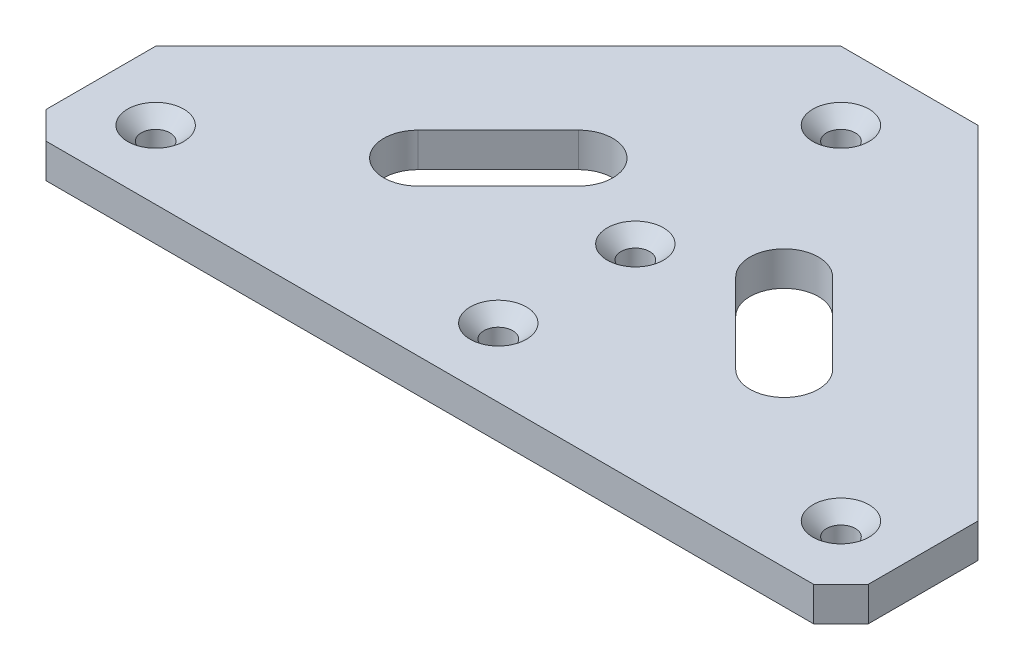
ISO-10303-21;
HEADER;
FILE_DESCRIPTION(('STEP AP214'),'2;1');
FILE_NAME('part.step','',(''),(''),'','','');
FILE_SCHEMA(('AUTOMOTIVE_DESIGN { 1 0 10303 214 1 1 1 1 }'));
ENDSEC;
DATA;
#1=APPLICATION_CONTEXT('core data for automotive mechanical design processes');
#2=APPLICATION_PROTOCOL_DEFINITION('international standard','automotive_design',2000,#1);
#3=PRODUCT_CONTEXT('',#1,'mechanical');
#4=PRODUCT('Part','Part','',(#3));
#5=PRODUCT_RELATED_PRODUCT_CATEGORY('part','',(#4));
#6=PRODUCT_DEFINITION_FORMATION('','',#4);
#7=PRODUCT_DEFINITION_CONTEXT('part definition',#1,'design');
#8=PRODUCT_DEFINITION('design','',#6,#7);
#9=PRODUCT_DEFINITION_SHAPE('','',#8);
#10=(LENGTH_UNIT() NAMED_UNIT(*) SI_UNIT(.MILLI.,.METRE.));
#11=(NAMED_UNIT(*) PLANE_ANGLE_UNIT() SI_UNIT($,.RADIAN.));
#12=(NAMED_UNIT(*) SI_UNIT($,.STERADIAN.) SOLID_ANGLE_UNIT());
#13=UNCERTAINTY_MEASURE_WITH_UNIT(LENGTH_MEASURE(1.E-05),#10,'distance_accuracy_value','');
#14=(GEOMETRIC_REPRESENTATION_CONTEXT(3) GLOBAL_UNCERTAINTY_ASSIGNED_CONTEXT((#13)) GLOBAL_UNIT_ASSIGNED_CONTEXT((#10,
#11,#12)) REPRESENTATION_CONTEXT('',''));
#15=CARTESIAN_POINT('',(0.,0.,0.));
#16=DIRECTION('',(0.,0.,1.));
#17=DIRECTION('',(1.,0.,0.));
#18=AXIS2_PLACEMENT_3D('',#15,#16,#17);
#19=CARTESIAN_POINT('',(0.,2.5,0.));
#20=DIRECTION('',(0.,-1.,0.));
#21=DIRECTION('',(0.,0.,-1.));
#22=AXIS2_PLACEMENT_3D('',#19,#20,#21);
#23=PLANE('',#22);
#24=DIRECTION('',(0.707106781186548,0.,-0.707106781186547));
#25=VECTOR('',#24,1.);
#26=CARTESIAN_POINT('',(-23.1801948466054,2.5,13.5355339059327));
#27=LINE('',#26,#25);
#28=CARTESIAN_POINT('',(-23.1801948466054,2.5,13.5355339059327));
#29=VERTEX_POINT('',#28);
#30=CARTESIAN_POINT('',(-11.4644660940673,2.5,1.81980515339463));
#31=VERTEX_POINT('',#30);
#32=EDGE_CURVE('E180',#29,#31,#27,.T.);
#33=ORIENTED_EDGE('',*,*,#32,.F.);
#34=CARTESIAN_POINT('',(-26.7157287525381,2.5,10.));
#35=DIRECTION('',(0.,1.,0.));
#36=DIRECTION('',(0.,0.,1.));
#37=AXIS2_PLACEMENT_3D('',#34,#35,#36);
#38=CIRCLE('',#37,4.99999999999999);
#39=CARTESIAN_POINT('',(-30.2512626584709,2.5,6.46446609406727));
#40=VERTEX_POINT('',#39);
#41=EDGE_CURVE('E53',#40,#29,#38,.T.);
#42=ORIENTED_EDGE('',*,*,#41,.F.);
#43=DIRECTION('',(-0.707106781186547,0.,0.707106781186548));
#44=VECTOR('',#43,1.);
#45=CARTESIAN_POINT('',(-30.2512626584709,2.5,6.46446609406727));
#46=LINE('',#45,#44);
#47=CARTESIAN_POINT('',(-18.5355339059327,2.5,-5.25126265847085));
#48=VERTEX_POINT('',#47);
#49=EDGE_CURVE('E171',#48,#40,#46,.T.);
#50=ORIENTED_EDGE('',*,*,#49,.F.);
#51=CARTESIAN_POINT('',(-15.,2.5,-1.71572875253811));
#52=DIRECTION('',(0.,1.,0.));
#53=DIRECTION('',(0.,0.,1.));
#54=AXIS2_PLACEMENT_3D('',#51,#52,#53);
#55=CIRCLE('',#54,5.);
#56=EDGE_CURVE('E174',#31,#48,#55,.T.);
#57=ORIENTED_EDGE('',*,*,#56,.F.);
#58=EDGE_LOOP('',(#33,#42,#50,#57));
#59=FACE_BOUND('',#58,.T.);
#60=DIRECTION('',(-0.707106781186548,0.,-0.707106781186548));
#61=VECTOR('',#60,1.);
#62=CARTESIAN_POINT('',(30.2512626584709,2.5,6.46446609406727));
#63=LINE('',#62,#61);
#64=CARTESIAN_POINT('',(30.2512626584708,2.5,6.46446609406727));
#65=VERTEX_POINT('',#64);
#66=CARTESIAN_POINT('',(18.5355339059327,2.5,-5.25126265847085));
#67=VERTEX_POINT('',#66);
#68=EDGE_CURVE('E206',#65,#67,#63,.T.);
#69=ORIENTED_EDGE('',*,*,#68,.F.);
#70=CARTESIAN_POINT('',(26.7157287525381,2.5,10.));
#71=DIRECTION('',(0.,1.,0.));
#72=DIRECTION('',(0.,0.,-1.));
#73=AXIS2_PLACEMENT_3D('',#70,#71,#72);
#74=CIRCLE('',#73,4.99999999999999);
#75=CARTESIAN_POINT('',(23.1801948466054,2.5,13.5355339059327));
#76=VERTEX_POINT('',#75);
#77=EDGE_CURVE('E61',#76,#65,#74,.T.);
#78=ORIENTED_EDGE('',*,*,#77,.F.);
#79=DIRECTION('',(0.707106781186548,0.,0.707106781186547));
#80=VECTOR('',#79,1.);
#81=CARTESIAN_POINT('',(23.1801948466054,2.5,13.5355339059327));
#82=LINE('',#81,#80);
#83=CARTESIAN_POINT('',(11.4644660940673,2.5,1.81980515339463));
#84=VERTEX_POINT('',#83);
#85=EDGE_CURVE('E195',#84,#76,#82,.T.);
#86=ORIENTED_EDGE('',*,*,#85,.F.);
#87=CARTESIAN_POINT('',(15.,2.5,-1.71572875253811));
#88=DIRECTION('',(0.,1.,0.));
#89=DIRECTION('',(0.,0.,-1.));
#90=AXIS2_PLACEMENT_3D('',#87,#88,#89);
#91=CIRCLE('',#90,5.);
#92=EDGE_CURVE('E209',#67,#84,#91,.T.);
#93=ORIENTED_EDGE('',*,*,#92,.F.);
#94=EDGE_LOOP('',(#69,#78,#86,#93));
#95=FACE_BOUND('',#94,.T.);
#96=CARTESIAN_POINT('',(-50.,2.5,25.));
#97=DIRECTION('',(0.,-1.,0.));
#98=DIRECTION('',(0.,0.,-1.));
#99=AXIS2_PLACEMENT_3D('',#96,#97,#98);
#100=CIRCLE('',#99,4.10000000000001);
#101=CARTESIAN_POINT('',(-50.,2.5,20.9));
#102=VERTEX_POINT('',#101);
#103=EDGE_CURVE('E290',#102,#102,#100,.T.);
#104=ORIENTED_EDGE('',*,*,#103,.T.);
#105=EDGE_LOOP('',(#104));
#106=FACE_BOUND('',#105,.T.);
#107=CARTESIAN_POINT('',(50.,2.5,25.));
#108=DIRECTION('',(0.,-1.,0.));
#109=DIRECTION('',(0.,0.,-1.));
#110=AXIS2_PLACEMENT_3D('',#107,#108,#109);
#111=CIRCLE('',#110,4.10000000000001);
#112=CARTESIAN_POINT('',(50.,2.5,20.9));
#113=VERTEX_POINT('',#112);
#114=EDGE_CURVE('E287',#113,#113,#111,.T.);
#115=ORIENTED_EDGE('',*,*,#114,.T.);
#116=EDGE_LOOP('',(#115));
#117=FACE_BOUND('',#116,.T.);
#118=CARTESIAN_POINT('',(0.,2.5,25.));
#119=DIRECTION('',(0.,-1.,0.));
#120=DIRECTION('',(0.,0.,-1.));
#121=AXIS2_PLACEMENT_3D('',#118,#119,#120);
#122=CIRCLE('',#121,4.10000000000001);
#123=CARTESIAN_POINT('',(0.,2.5,20.9));
#124=VERTEX_POINT('',#123);
#125=EDGE_CURVE('E284',#124,#124,#122,.T.);
#126=ORIENTED_EDGE('',*,*,#125,.T.);
#127=EDGE_LOOP('',(#126));
#128=FACE_BOUND('',#127,.T.);
#129=CARTESIAN_POINT('',(0.,2.5,5.));
#130=DIRECTION('',(0.,-1.,0.));
#131=DIRECTION('',(0.,0.,-1.));
#132=AXIS2_PLACEMENT_3D('',#129,#130,#131);
#133=CIRCLE('',#132,4.10000000000001);
#134=CARTESIAN_POINT('',(0.,2.5,0.899999999999995));
#135=VERTEX_POINT('',#134);
#136=EDGE_CURVE('E281',#135,#135,#133,.T.);
#137=ORIENTED_EDGE('',*,*,#136,.T.);
#138=EDGE_LOOP('',(#137));
#139=FACE_BOUND('',#138,.T.);
#140=CARTESIAN_POINT('',(0.,2.5,-25.));
#141=DIRECTION('',(0.,-1.,0.));
#142=DIRECTION('',(0.,0.,-1.));
#143=AXIS2_PLACEMENT_3D('',#140,#141,#142);
#144=CIRCLE('',#143,4.10000000000001);
#145=CARTESIAN_POINT('',(0.,2.5,-29.1));
#146=VERTEX_POINT('',#145);
#147=EDGE_CURVE('E278',#146,#146,#144,.T.);
#148=ORIENTED_EDGE('',*,*,#147,.T.);
#149=EDGE_LOOP('',(#148));
#150=FACE_BOUND('',#149,.T.);
#151=DIRECTION('',(1.,0.,0.));
#152=VECTOR('',#151,1.);
#153=CARTESIAN_POINT('',(-60.,2.5,35.));
#154=LINE('',#153,#152);
#155=CARTESIAN_POINT('',(-56.,2.5,35.));
#156=VERTEX_POINT('',#155);
#157=CARTESIAN_POINT('',(56.,2.5,35.));
#158=VERTEX_POINT('',#157);
#159=EDGE_CURVE('E243',#156,#158,#154,.T.);
#160=ORIENTED_EDGE('',*,*,#159,.T.);
#161=DIRECTION('',(-0.707106781186549,0.,0.707106781186546));
#162=VECTOR('',#161,1.);
#163=CARTESIAN_POINT('',(60.,2.5,31.));
#164=LINE('',#163,#162);
#165=CARTESIAN_POINT('',(60.,2.5,31.));
#166=VERTEX_POINT('',#165);
#167=EDGE_CURVE('E46',#158,#166,#164,.F.);
#168=ORIENTED_EDGE('',*,*,#167,.T.);
#169=DIRECTION('',(0.,0.,-1.));
#170=VECTOR('',#169,1.);
#171=CARTESIAN_POINT('',(60.,2.5,15.));
#172=LINE('',#171,#170);
#173=CARTESIAN_POINT('',(60.,2.5,15.));
#174=VERTEX_POINT('',#173);
#175=EDGE_CURVE('E246',#166,#174,#172,.T.);
#176=ORIENTED_EDGE('',*,*,#175,.T.);
#177=DIRECTION('',(-0.707106781186547,0.,-0.707106781186548));
#178=VECTOR('',#177,1.);
#179=CARTESIAN_POINT('',(10.,2.5,-35.));
#180=LINE('',#179,#178);
#181=CARTESIAN_POINT('',(10.,2.5,-35.));
#182=VERTEX_POINT('',#181);
#183=EDGE_CURVE('E248',#174,#182,#180,.T.);
#184=ORIENTED_EDGE('',*,*,#183,.T.);
#185=DIRECTION('',(-1.,0.,0.));
#186=VECTOR('',#185,1.);
#187=CARTESIAN_POINT('',(0.,2.5,-35.));
#188=LINE('',#187,#186);
#189=CARTESIAN_POINT('',(-10.,2.5,-35.));
#190=VERTEX_POINT('',#189);
#191=EDGE_CURVE('E235',#182,#190,#188,.T.);
#192=ORIENTED_EDGE('',*,*,#191,.T.);
#193=DIRECTION('',(-0.707106781186547,0.,0.707106781186548));
#194=VECTOR('',#193,1.);
#195=CARTESIAN_POINT('',(-10.,2.5,-35.));
#196=LINE('',#195,#194);
#197=CARTESIAN_POINT('',(-60.,2.5,15.));
#198=VERTEX_POINT('',#197);
#199=EDGE_CURVE('E237',#190,#198,#196,.T.);
#200=ORIENTED_EDGE('',*,*,#199,.T.);
#201=DIRECTION('',(0.,0.,1.));
#202=VECTOR('',#201,1.);
#203=CARTESIAN_POINT('',(-60.,2.5,15.));
#204=LINE('',#203,#202);
#205=CARTESIAN_POINT('',(-60.,2.5,31.));
#206=VERTEX_POINT('',#205);
#207=EDGE_CURVE('E240',#198,#206,#204,.T.);
#208=ORIENTED_EDGE('',*,*,#207,.T.);
#209=DIRECTION('',(-0.707106781186545,0.,-0.70710678118655));
#210=VECTOR('',#209,1.);
#211=CARTESIAN_POINT('',(-56.,2.5,35.));
#212=LINE('',#211,#210);
#213=EDGE_CURVE('E317',#206,#156,#212,.F.);
#214=ORIENTED_EDGE('',*,*,#213,.T.);
#215=EDGE_LOOP('',(#160,#168,#176,#184,#192,#200,#208,#214));
#216=FACE_BOUND('',#215,.T.);
#217=ADVANCED_FACE('F37',(#59,#95,#106,#117,#128,#139,#150,#216),#23,.F.);
#218=CARTESIAN_POINT('',(0.,-2.5,0.));
#219=DIRECTION('',(0.,-1.,0.));
#220=DIRECTION('',(0.,0.,-1.));
#221=AXIS2_PLACEMENT_3D('',#218,#219,#220);
#222=PLANE('',#221);
#223=CARTESIAN_POINT('',(-26.7157287525381,-2.5,10.));
#224=DIRECTION('',(0.,1.,0.));
#225=DIRECTION('',(0.,0.,1.));
#226=AXIS2_PLACEMENT_3D('',#223,#224,#225);
#227=CIRCLE('',#226,4.99999999999999);
#228=CARTESIAN_POINT('',(-30.2512626584709,-2.5,6.46446609406727));
#229=VERTEX_POINT('',#228);
#230=CARTESIAN_POINT('',(-23.1801948466054,-2.5,13.5355339059327));
#231=VERTEX_POINT('',#230);
#232=EDGE_CURVE('E152',#229,#231,#227,.T.);
#233=ORIENTED_EDGE('',*,*,#232,.T.);
#234=DIRECTION('',(0.707106781186548,0.,-0.707106781186547));
#235=VECTOR('',#234,1.);
#236=CARTESIAN_POINT('',(-23.1801948466054,-2.5,13.5355339059327));
#237=LINE('',#236,#235);
#238=CARTESIAN_POINT('',(-11.4644660940673,-2.5,1.81980515339463));
#239=VERTEX_POINT('',#238);
#240=EDGE_CURVE('E162',#231,#239,#237,.T.);
#241=ORIENTED_EDGE('',*,*,#240,.T.);
#242=CARTESIAN_POINT('',(-15.,-2.5,-1.71572875253811));
#243=DIRECTION('',(0.,1.,0.));
#244=DIRECTION('',(0.,0.,1.));
#245=AXIS2_PLACEMENT_3D('',#242,#243,#244);
#246=CIRCLE('',#245,5.);
#247=CARTESIAN_POINT('',(-18.5355339059327,-2.5,-5.25126265847085));
#248=VERTEX_POINT('',#247);
#249=EDGE_CURVE('E166',#239,#248,#246,.T.);
#250=ORIENTED_EDGE('',*,*,#249,.T.);
#251=DIRECTION('',(-0.707106781186547,0.,0.707106781186548));
#252=VECTOR('',#251,1.);
#253=CARTESIAN_POINT('',(-30.2512626584709,-2.5,6.46446609406727));
#254=LINE('',#253,#252);
#255=EDGE_CURVE('E158',#248,#229,#254,.T.);
#256=ORIENTED_EDGE('',*,*,#255,.T.);
#257=EDGE_LOOP('',(#233,#241,#250,#256));
#258=FACE_BOUND('',#257,.T.);
#259=CARTESIAN_POINT('',(26.7157287525381,-2.5,10.));
#260=DIRECTION('',(0.,1.,0.));
#261=DIRECTION('',(0.,0.,-1.));
#262=AXIS2_PLACEMENT_3D('',#259,#260,#261);
#263=CIRCLE('',#262,4.99999999999999);
#264=CARTESIAN_POINT('',(23.1801948466054,-2.5,13.5355339059327));
#265=VERTEX_POINT('',#264);
#266=CARTESIAN_POINT('',(30.2512626584709,-2.5,6.46446609406727));
#267=VERTEX_POINT('',#266);
#268=EDGE_CURVE('E191',#265,#267,#263,.T.);
#269=ORIENTED_EDGE('',*,*,#268,.T.);
#270=DIRECTION('',(-0.707106781186548,0.,-0.707106781186548));
#271=VECTOR('',#270,1.);
#272=CARTESIAN_POINT('',(30.2512626584709,-2.5,6.46446609406727));
#273=LINE('',#272,#271);
#274=CARTESIAN_POINT('',(18.5355339059327,-2.5,-5.25126265847085));
#275=VERTEX_POINT('',#274);
#276=EDGE_CURVE('E194',#267,#275,#273,.T.);
#277=ORIENTED_EDGE('',*,*,#276,.T.);
#278=CARTESIAN_POINT('',(15.,-2.5,-1.71572875253811));
#279=DIRECTION('',(0.,1.,0.));
#280=DIRECTION('',(0.,0.,-1.));
#281=AXIS2_PLACEMENT_3D('',#278,#279,#280);
#282=CIRCLE('',#281,5.);
#283=CARTESIAN_POINT('',(11.4644660940673,-2.5,1.81980515339463));
#284=VERTEX_POINT('',#283);
#285=EDGE_CURVE('E198',#275,#284,#282,.T.);
#286=ORIENTED_EDGE('',*,*,#285,.T.);
#287=DIRECTION('',(0.707106781186548,0.,0.707106781186547));
#288=VECTOR('',#287,1.);
#289=CARTESIAN_POINT('',(23.1801948466054,-2.5,13.5355339059327));
#290=LINE('',#289,#288);
#291=EDGE_CURVE('E201',#284,#265,#290,.T.);
#292=ORIENTED_EDGE('',*,*,#291,.T.);
#293=EDGE_LOOP('',(#269,#277,#286,#292));
#294=FACE_BOUND('',#293,.T.);
#295=CARTESIAN_POINT('',(0.,-2.5,25.));
#296=DIRECTION('',(0.,1.,0.));
#297=DIRECTION('',(0.,0.,1.));
#298=AXIS2_PLACEMENT_3D('',#295,#296,#297);
#299=CIRCLE('',#298,2.1);
#300=CARTESIAN_POINT('',(0.,-2.5,27.1));
#301=VERTEX_POINT('',#300);
#302=EDGE_CURVE('E222',#301,#301,#299,.T.);
#303=ORIENTED_EDGE('',*,*,#302,.T.);
#304=EDGE_LOOP('',(#303));
#305=FACE_BOUND('',#304,.T.);
#306=CARTESIAN_POINT('',(0.,-2.5,-25.));
#307=DIRECTION('',(0.,1.,0.));
#308=DIRECTION('',(0.,0.,1.));
#309=AXIS2_PLACEMENT_3D('',#306,#307,#308);
#310=CIRCLE('',#309,2.1);
#311=CARTESIAN_POINT('',(0.,-2.5,-22.9));
#312=VERTEX_POINT('',#311);
#313=EDGE_CURVE('E228',#312,#312,#310,.T.);
#314=ORIENTED_EDGE('',*,*,#313,.T.);
#315=EDGE_LOOP('',(#314));
#316=FACE_BOUND('',#315,.T.);
#317=DIRECTION('',(0.,0.,-1.));
#318=VECTOR('',#317,1.);
#319=CARTESIAN_POINT('',(60.,-2.5,15.));
#320=LINE('',#319,#318);
#321=CARTESIAN_POINT('',(60.,-2.5,31.));
#322=VERTEX_POINT('',#321);
#323=CARTESIAN_POINT('',(60.,-2.5,15.));
#324=VERTEX_POINT('',#323);
#325=EDGE_CURVE('E260',#322,#324,#320,.T.);
#326=ORIENTED_EDGE('',*,*,#325,.F.);
#327=DIRECTION('',(0.707106781186549,0.,-0.707106781186546));
#328=VECTOR('',#327,1.);
#329=CARTESIAN_POINT('',(45.4999999999999,-2.5,45.5000000000001));
#330=LINE('',#329,#328);
#331=CARTESIAN_POINT('',(56.,-2.5,35.));
#332=VERTEX_POINT('',#331);
#333=EDGE_CURVE('E310',#322,#332,#330,.F.);
#334=ORIENTED_EDGE('',*,*,#333,.T.);
#335=DIRECTION('',(1.,0.,0.));
#336=VECTOR('',#335,1.);
#337=CARTESIAN_POINT('',(-60.,-2.5,35.));
#338=LINE('',#337,#336);
#339=CARTESIAN_POINT('',(-56.,-2.5,35.));
#340=VERTEX_POINT('',#339);
#341=EDGE_CURVE('E257',#340,#332,#338,.T.);
#342=ORIENTED_EDGE('',*,*,#341,.F.);
#343=DIRECTION('',(0.707106781186545,0.,0.70710678118655));
#344=VECTOR('',#343,1.);
#345=CARTESIAN_POINT('',(-45.5000000000002,-2.5,45.4999999999999));
#346=LINE('',#345,#344);
#347=CARTESIAN_POINT('',(-60.,-2.5,31.));
#348=VERTEX_POINT('',#347);
#349=EDGE_CURVE('E308',#340,#348,#346,.F.);
#350=ORIENTED_EDGE('',*,*,#349,.T.);
#351=DIRECTION('',(0.,0.,1.));
#352=VECTOR('',#351,1.);
#353=CARTESIAN_POINT('',(-60.,-2.5,15.));
#354=LINE('',#353,#352);
#355=CARTESIAN_POINT('',(-60.,-2.5,15.));
#356=VERTEX_POINT('',#355);
#357=EDGE_CURVE('E254',#356,#348,#354,.T.);
#358=ORIENTED_EDGE('',*,*,#357,.F.);
#359=DIRECTION('',(-0.707106781186547,0.,0.707106781186548));
#360=VECTOR('',#359,1.);
#361=CARTESIAN_POINT('',(-10.,-2.5,-35.));
#362=LINE('',#361,#360);
#363=CARTESIAN_POINT('',(-10.,-2.5,-35.));
#364=VERTEX_POINT('',#363);
#365=EDGE_CURVE('E252',#364,#356,#362,.T.);
#366=ORIENTED_EDGE('',*,*,#365,.F.);
#367=DIRECTION('',(-1.,0.,0.));
#368=VECTOR('',#367,1.);
#369=CARTESIAN_POINT('',(0.,-2.5,-35.));
#370=LINE('',#369,#368);
#371=CARTESIAN_POINT('',(10.,-2.5,-35.));
#372=VERTEX_POINT('',#371);
#373=EDGE_CURVE('E234',#372,#364,#370,.T.);
#374=ORIENTED_EDGE('',*,*,#373,.F.);
#375=DIRECTION('',(-0.707106781186547,0.,-0.707106781186548));
#376=VECTOR('',#375,1.);
#377=CARTESIAN_POINT('',(10.,-2.5,-35.));
#378=LINE('',#377,#376);
#379=EDGE_CURVE('E238',#324,#372,#378,.T.);
#380=ORIENTED_EDGE('',*,*,#379,.F.);
#381=EDGE_LOOP('',(#326,#334,#342,#350,#358,#366,#374,#380));
#382=FACE_BOUND('',#381,.T.);
#383=CARTESIAN_POINT('',(-50.,-2.5,25.));
#384=DIRECTION('',(0.,1.,0.));
#385=DIRECTION('',(0.,0.,1.));
#386=AXIS2_PLACEMENT_3D('',#383,#384,#385);
#387=CIRCLE('',#386,2.1);
#388=CARTESIAN_POINT('',(-50.,-2.5,27.1));
#389=VERTEX_POINT('',#388);
#390=EDGE_CURVE('E231',#389,#389,#387,.T.);
#391=ORIENTED_EDGE('',*,*,#390,.T.);
#392=EDGE_LOOP('',(#391));
#393=FACE_BOUND('',#392,.T.);
#394=CARTESIAN_POINT('',(0.,-2.5,5.));
#395=DIRECTION('',(0.,1.,0.));
#396=DIRECTION('',(0.,0.,1.));
#397=AXIS2_PLACEMENT_3D('',#394,#395,#396);
#398=CIRCLE('',#397,2.1);
#399=CARTESIAN_POINT('',(0.,-2.5,7.1));
#400=VERTEX_POINT('',#399);
#401=EDGE_CURVE('E225',#400,#400,#398,.T.);
#402=ORIENTED_EDGE('',*,*,#401,.T.);
#403=EDGE_LOOP('',(#402));
#404=FACE_BOUND('',#403,.T.);
#405=CARTESIAN_POINT('',(50.,-2.5,25.));
#406=DIRECTION('',(0.,1.,0.));
#407=DIRECTION('',(0.,0.,-1.));
#408=AXIS2_PLACEMENT_3D('',#405,#406,#407);
#409=CIRCLE('',#408,2.1);
#410=CARTESIAN_POINT('',(50.,-2.5,22.9));
#411=VERTEX_POINT('',#410);
#412=EDGE_CURVE('E187',#411,#411,#409,.T.);
#413=ORIENTED_EDGE('',*,*,#412,.T.);
#414=EDGE_LOOP('',(#413));
#415=FACE_BOUND('',#414,.T.);
#416=ADVANCED_FACE('F168',(#258,#294,#305,#316,#382,#393,#404,#415),#222,.T.);
#417=CARTESIAN_POINT('',(0.,2.5,-35.));
#418=DIRECTION('',(0.,0.,1.));
#419=DIRECTION('',(1.,0.,0.));
#420=AXIS2_PLACEMENT_3D('',#417,#418,#419);
#421=PLANE('',#420);
#422=ORIENTED_EDGE('',*,*,#373,.T.);
#423=DIRECTION('',(0.,-1.,0.));
#424=VECTOR('',#423,1.);
#425=CARTESIAN_POINT('',(-10.,2.5,-35.));
#426=LINE('',#425,#424);
#427=EDGE_CURVE('E272',#190,#364,#426,.T.);
#428=ORIENTED_EDGE('',*,*,#427,.F.);
#429=ORIENTED_EDGE('',*,*,#191,.F.);
#430=DIRECTION('',(0.,-1.,0.));
#431=VECTOR('',#430,1.);
#432=CARTESIAN_POINT('',(10.,2.5,-35.));
#433=LINE('',#432,#431);
#434=EDGE_CURVE('E250',#182,#372,#433,.T.);
#435=ORIENTED_EDGE('',*,*,#434,.T.);
#436=EDGE_LOOP('',(#422,#428,#429,#435));
#437=FACE_BOUND('',#436,.T.);
#438=ADVANCED_FACE('F356',(#437),#421,.F.);
#439=CARTESIAN_POINT('',(-10.,2.5,-35.));
#440=DIRECTION('',(0.707106781186548,0.,0.707106781186547));
#441=DIRECTION('',(0.707106781186547,0.,-0.707106781186548));
#442=AXIS2_PLACEMENT_3D('',#439,#440,#441);
#443=PLANE('',#442);
#444=ORIENTED_EDGE('',*,*,#365,.T.);
#445=DIRECTION('',(0.,-1.,0.));
#446=VECTOR('',#445,1.);
#447=CARTESIAN_POINT('',(-60.,2.5,15.));
#448=LINE('',#447,#446);
#449=EDGE_CURVE('E269',#198,#356,#448,.T.);
#450=ORIENTED_EDGE('',*,*,#449,.F.);
#451=ORIENTED_EDGE('',*,*,#199,.F.);
#452=ORIENTED_EDGE('',*,*,#427,.T.);
#453=EDGE_LOOP('',(#444,#450,#451,#452));
#454=FACE_BOUND('',#453,.T.);
#455=ADVANCED_FACE('F349',(#454),#443,.F.);
#456=CARTESIAN_POINT('',(-60.,2.5,15.));
#457=DIRECTION('',(1.,0.,0.));
#458=DIRECTION('',(0.,0.,-1.));
#459=AXIS2_PLACEMENT_3D('',#456,#457,#458);
#460=PLANE('',#459);
#461=ORIENTED_EDGE('',*,*,#357,.T.);
#462=DIRECTION('',(0.,1.,0.));
#463=VECTOR('',#462,1.);
#464=CARTESIAN_POINT('',(-60.,2.5,31.));
#465=LINE('',#464,#463);
#466=EDGE_CURVE('E11',#348,#206,#465,.T.);
#467=ORIENTED_EDGE('',*,*,#466,.T.);
#468=ORIENTED_EDGE('',*,*,#207,.F.);
#469=ORIENTED_EDGE('',*,*,#449,.T.);
#470=EDGE_LOOP('',(#461,#467,#468,#469));
#471=FACE_BOUND('',#470,.T.);
#472=ADVANCED_FACE('F344',(#471),#460,.F.);
#473=CARTESIAN_POINT('',(-60.,2.5,35.));
#474=DIRECTION('',(0.,0.,-1.));
#475=DIRECTION('',(-1.,0.,0.));
#476=AXIS2_PLACEMENT_3D('',#473,#474,#475);
#477=PLANE('',#476);
#478=ORIENTED_EDGE('',*,*,#341,.T.);
#479=DIRECTION('',(0.,1.,0.));
#480=VECTOR('',#479,1.);
#481=CARTESIAN_POINT('',(56.,2.5,35.));
#482=LINE('',#481,#480);
#483=EDGE_CURVE('E315',#332,#158,#482,.T.);
#484=ORIENTED_EDGE('',*,*,#483,.T.);
#485=ORIENTED_EDGE('',*,*,#159,.F.);
#486=DIRECTION('',(0.,-1.,0.));
#487=VECTOR('',#486,1.);
#488=CARTESIAN_POINT('',(-56.,2.5,35.));
#489=LINE('',#488,#487);
#490=EDGE_CURVE('E312',#156,#340,#489,.T.);
#491=ORIENTED_EDGE('',*,*,#490,.T.);
#492=EDGE_LOOP('',(#478,#484,#485,#491));
#493=FACE_BOUND('',#492,.T.);
#494=ADVANCED_FACE('F336',(#493),#477,.F.);
#495=CARTESIAN_POINT('',(60.,2.5,15.));
#496=DIRECTION('',(-1.,0.,0.));
#497=DIRECTION('',(0.,0.,1.));
#498=AXIS2_PLACEMENT_3D('',#495,#496,#497);
#499=PLANE('',#498);
#500=ORIENTED_EDGE('',*,*,#175,.F.);
#501=DIRECTION('',(0.,-1.,0.));
#502=VECTOR('',#501,1.);
#503=CARTESIAN_POINT('',(60.,2.5,31.));
#504=LINE('',#503,#502);
#505=EDGE_CURVE('E305',#166,#322,#504,.T.);
#506=ORIENTED_EDGE('',*,*,#505,.T.);
#507=ORIENTED_EDGE('',*,*,#325,.T.);
#508=DIRECTION('',(0.,-1.,0.));
#509=VECTOR('',#508,1.);
#510=CARTESIAN_POINT('',(60.,2.5,15.));
#511=LINE('',#510,#509);
#512=EDGE_CURVE('E266',#174,#324,#511,.T.);
#513=ORIENTED_EDGE('',*,*,#512,.F.);
#514=EDGE_LOOP('',(#500,#506,#507,#513));
#515=FACE_BOUND('',#514,.T.);
#516=ADVANCED_FACE('F327',(#515),#499,.F.);
#517=CARTESIAN_POINT('',(10.,2.5,-35.));
#518=DIRECTION('',(-0.707106781186548,0.,0.707106781186547));
#519=DIRECTION('',(0.707106781186547,0.,0.707106781186548));
#520=AXIS2_PLACEMENT_3D('',#517,#518,#519);
#521=PLANE('',#520);
#522=ORIENTED_EDGE('',*,*,#379,.T.);
#523=ORIENTED_EDGE('',*,*,#434,.F.);
#524=ORIENTED_EDGE('',*,*,#183,.F.);
#525=ORIENTED_EDGE('',*,*,#512,.T.);
#526=EDGE_LOOP('',(#522,#523,#524,#525));
#527=FACE_BOUND('',#526,.T.);
#528=ADVANCED_FACE('F354',(#527),#521,.F.);
#529=CARTESIAN_POINT('',(-50.,2.5,25.));
#530=DIRECTION('',(0.,-1.,0.));
#531=DIRECTION('',(0.,0.,-1.));
#532=AXIS2_PLACEMENT_3D('',#529,#530,#531);
#533=CYLINDRICAL_SURFACE('',#532,2.1);
#534=CARTESIAN_POINT('',(-50.,0.500000000000012,25.));
#535=DIRECTION('',(0.,-1.,0.));
#536=DIRECTION('',(0.,0.,-1.));
#537=AXIS2_PLACEMENT_3D('',#534,#535,#536);
#538=CIRCLE('',#537,2.1);
#539=CARTESIAN_POINT('',(-50.,0.500000000000012,22.9));
#540=VERTEX_POINT('',#539);
#541=EDGE_CURVE('E275',#540,#540,#538,.F.);
#542=ORIENTED_EDGE('',*,*,#541,.T.);
#543=EDGE_LOOP('',(#542));
#544=FACE_BOUND('',#543,.T.);
#545=ORIENTED_EDGE('',*,*,#390,.F.);
#546=EDGE_LOOP('',(#545));
#547=FACE_BOUND('',#546,.T.);
#548=ADVANCED_FACE('F373',(#544,#547),#533,.F.);
#549=CARTESIAN_POINT('',(0.,2.5,-25.));
#550=DIRECTION('',(0.,-1.,0.));
#551=DIRECTION('',(0.,0.,-1.));
#552=AXIS2_PLACEMENT_3D('',#549,#550,#551);
#553=CYLINDRICAL_SURFACE('',#552,2.1);
#554=CARTESIAN_POINT('',(0.,0.500000000000015,-25.));
#555=DIRECTION('',(0.,-1.,0.));
#556=DIRECTION('',(0.,0.,-1.));
#557=AXIS2_PLACEMENT_3D('',#554,#555,#556);
#558=CIRCLE('',#557,2.1);
#559=CARTESIAN_POINT('',(0.,0.500000000000015,-27.1));
#560=VERTEX_POINT('',#559);
#561=EDGE_CURVE('E302',#560,#560,#558,.F.);
#562=ORIENTED_EDGE('',*,*,#561,.T.);
#563=EDGE_LOOP('',(#562));
#564=FACE_BOUND('',#563,.T.);
#565=ORIENTED_EDGE('',*,*,#313,.F.);
#566=EDGE_LOOP('',(#565));
#567=FACE_BOUND('',#566,.T.);
#568=ADVANCED_FACE('F407',(#564,#567),#553,.F.);
#569=CARTESIAN_POINT('',(0.,2.5,5.));
#570=DIRECTION('',(0.,-1.,0.));
#571=DIRECTION('',(0.,0.,-1.));
#572=AXIS2_PLACEMENT_3D('',#569,#570,#571);
#573=CYLINDRICAL_SURFACE('',#572,2.1);
#574=CARTESIAN_POINT('',(0.,0.500000000000015,5.));
#575=DIRECTION('',(0.,-1.,0.));
#576=DIRECTION('',(0.,0.,-1.));
#577=AXIS2_PLACEMENT_3D('',#574,#575,#576);
#578=CIRCLE('',#577,2.1);
#579=CARTESIAN_POINT('',(0.,0.500000000000015,2.9));
#580=VERTEX_POINT('',#579);
#581=EDGE_CURVE('E299',#580,#580,#578,.F.);
#582=ORIENTED_EDGE('',*,*,#581,.T.);
#583=EDGE_LOOP('',(#582));
#584=FACE_BOUND('',#583,.T.);
#585=ORIENTED_EDGE('',*,*,#401,.F.);
#586=EDGE_LOOP('',(#585));
#587=FACE_BOUND('',#586,.T.);
#588=ADVANCED_FACE('F414',(#584,#587),#573,.F.);
#589=CARTESIAN_POINT('',(0.,2.5,25.));
#590=DIRECTION('',(0.,-1.,0.));
#591=DIRECTION('',(0.,0.,-1.));
#592=AXIS2_PLACEMENT_3D('',#589,#590,#591);
#593=CYLINDRICAL_SURFACE('',#592,2.1);
#594=CARTESIAN_POINT('',(0.,0.500000000000015,25.));
#595=DIRECTION('',(0.,-1.,0.));
#596=DIRECTION('',(0.,0.,-1.));
#597=AXIS2_PLACEMENT_3D('',#594,#595,#596);
#598=CIRCLE('',#597,2.1);
#599=CARTESIAN_POINT('',(0.,0.500000000000015,22.9));
#600=VERTEX_POINT('',#599);
#601=EDGE_CURVE('E296',#600,#600,#598,.F.);
#602=ORIENTED_EDGE('',*,*,#601,.T.);
#603=EDGE_LOOP('',(#602));
#604=FACE_BOUND('',#603,.T.);
#605=ORIENTED_EDGE('',*,*,#302,.F.);
#606=EDGE_LOOP('',(#605));
#607=FACE_BOUND('',#606,.T.);
#608=ADVANCED_FACE('F421',(#604,#607),#593,.F.);
#609=CARTESIAN_POINT('',(50.,2.5,25.));
#610=DIRECTION('',(0.,-1.,0.));
#611=DIRECTION('',(0.,0.,-1.));
#612=AXIS2_PLACEMENT_3D('',#609,#610,#611);
#613=CYLINDRICAL_SURFACE('',#612,2.1);
#614=CARTESIAN_POINT('',(50.,0.500000000000012,25.));
#615=DIRECTION('',(0.,-1.,0.));
#616=DIRECTION('',(0.,0.,-1.));
#617=AXIS2_PLACEMENT_3D('',#614,#615,#616);
#618=CIRCLE('',#617,2.1);
#619=CARTESIAN_POINT('',(50.,0.500000000000012,22.9));
#620=VERTEX_POINT('',#619);
#621=EDGE_CURVE('E293',#620,#620,#618,.F.);
#622=ORIENTED_EDGE('',*,*,#621,.T.);
#623=EDGE_LOOP('',(#622));
#624=FACE_BOUND('',#623,.T.);
#625=ORIENTED_EDGE('',*,*,#412,.F.);
#626=EDGE_LOOP('',(#625));
#627=FACE_BOUND('',#626,.T.);
#628=ADVANCED_FACE('F429',(#624,#627),#613,.F.);
#629=CARTESIAN_POINT('',(-50.,0.500000000000012,25.));
#630=DIRECTION('',(0.,1.,0.));
#631=DIRECTION('',(0.,0.,1.));
#632=AXIS2_PLACEMENT_3D('',#629,#630,#631);
#633=CONICAL_SURFACE('',#632,2.1,0.785398163397453);
#634=ORIENTED_EDGE('',*,*,#103,.F.);
#635=EDGE_LOOP('',(#634));
#636=FACE_BOUND('',#635,.T.);
#637=ORIENTED_EDGE('',*,*,#541,.F.);
#638=EDGE_LOOP('',(#637));
#639=FACE_BOUND('',#638,.T.);
#640=ADVANCED_FACE('F437',(#636,#639),#633,.F.);
#641=CARTESIAN_POINT('',(50.,0.500000000000012,25.));
#642=DIRECTION('',(0.,1.,0.));
#643=DIRECTION('',(0.,0.,1.));
#644=AXIS2_PLACEMENT_3D('',#641,#642,#643);
#645=CONICAL_SURFACE('',#644,2.1,0.785398163397453);
#646=ORIENTED_EDGE('',*,*,#114,.F.);
#647=EDGE_LOOP('',(#646));
#648=FACE_BOUND('',#647,.T.);
#649=ORIENTED_EDGE('',*,*,#621,.F.);
#650=EDGE_LOOP('',(#649));
#651=FACE_BOUND('',#650,.T.);
#652=ADVANCED_FACE('F445',(#648,#651),#645,.F.);
#653=CARTESIAN_POINT('',(0.,0.500000000000015,25.));
#654=DIRECTION('',(0.,1.,0.));
#655=DIRECTION('',(0.,0.,1.));
#656=AXIS2_PLACEMENT_3D('',#653,#654,#655);
#657=CONICAL_SURFACE('',#656,2.1,0.785398163397453);
#658=ORIENTED_EDGE('',*,*,#125,.F.);
#659=EDGE_LOOP('',(#658));
#660=FACE_BOUND('',#659,.T.);
#661=ORIENTED_EDGE('',*,*,#601,.F.);
#662=EDGE_LOOP('',(#661));
#663=FACE_BOUND('',#662,.T.);
#664=ADVANCED_FACE('F452',(#660,#663),#657,.F.);
#665=CARTESIAN_POINT('',(0.,0.500000000000015,5.));
#666=DIRECTION('',(0.,1.,0.));
#667=DIRECTION('',(0.,0.,1.));
#668=AXIS2_PLACEMENT_3D('',#665,#666,#667);
#669=CONICAL_SURFACE('',#668,2.1,0.785398163397453);
#670=ORIENTED_EDGE('',*,*,#136,.F.);
#671=EDGE_LOOP('',(#670));
#672=FACE_BOUND('',#671,.T.);
#673=ORIENTED_EDGE('',*,*,#581,.F.);
#674=EDGE_LOOP('',(#673));
#675=FACE_BOUND('',#674,.T.);
#676=ADVANCED_FACE('F460',(#672,#675),#669,.F.);
#677=CARTESIAN_POINT('',(0.,0.500000000000015,-25.));
#678=DIRECTION('',(0.,1.,0.));
#679=DIRECTION('',(0.,0.,1.));
#680=AXIS2_PLACEMENT_3D('',#677,#678,#679);
#681=CONICAL_SURFACE('',#680,2.1,0.785398163397453);
#682=ORIENTED_EDGE('',*,*,#147,.F.);
#683=EDGE_LOOP('',(#682));
#684=FACE_BOUND('',#683,.T.);
#685=ORIENTED_EDGE('',*,*,#561,.F.);
#686=EDGE_LOOP('',(#685));
#687=FACE_BOUND('',#686,.T.);
#688=ADVANCED_FACE('F468',(#684,#687),#681,.F.);
#689=CARTESIAN_POINT('',(60.,2.5,31.));
#690=DIRECTION('',(-0.707106781186546,0.,-0.707106781186549));
#691=DIRECTION('',(0.,-1.,0.));
#692=AXIS2_PLACEMENT_3D('',#689,#690,#691);
#693=PLANE('',#692);
#694=ORIENTED_EDGE('',*,*,#167,.F.);
#695=ORIENTED_EDGE('',*,*,#483,.F.);
#696=ORIENTED_EDGE('',*,*,#333,.F.);
#697=ORIENTED_EDGE('',*,*,#505,.F.);
#698=EDGE_LOOP('',(#694,#695,#696,#697));
#699=FACE_BOUND('',#698,.T.);
#700=ADVANCED_FACE('F330',(#699),#693,.F.);
#701=CARTESIAN_POINT('',(-56.,2.5,35.));
#702=DIRECTION('',(0.70710678118655,0.,-0.707106781186545));
#703=DIRECTION('',(0.,-1.,0.));
#704=AXIS2_PLACEMENT_3D('',#701,#702,#703);
#705=PLANE('',#704);
#706=ORIENTED_EDGE('',*,*,#213,.F.);
#707=ORIENTED_EDGE('',*,*,#466,.F.);
#708=ORIENTED_EDGE('',*,*,#349,.F.);
#709=ORIENTED_EDGE('',*,*,#490,.F.);
#710=EDGE_LOOP('',(#706,#707,#708,#709));
#711=FACE_BOUND('',#710,.T.);
#712=ADVANCED_FACE('F40',(#711),#705,.F.);
#713=CARTESIAN_POINT('',(26.7157287525381,-2.5,10.));
#714=DIRECTION('',(0.,1.,0.));
#715=DIRECTION('',(0.,0.,1.));
#716=AXIS2_PLACEMENT_3D('',#713,#714,#715);
#717=CYLINDRICAL_SURFACE('',#716,4.99999999999999);
#718=ORIENTED_EDGE('',*,*,#77,.T.);
#719=DIRECTION('',(0.,1.,0.));
#720=VECTOR('',#719,1.);
#721=CARTESIAN_POINT('',(30.2512626584709,-2.5,6.46446609406727));
#722=LINE('',#721,#720);
#723=EDGE_CURVE('E204',#267,#65,#722,.T.);
#724=ORIENTED_EDGE('',*,*,#723,.F.);
#725=ORIENTED_EDGE('',*,*,#268,.F.);
#726=DIRECTION('',(0.,1.,0.));
#727=VECTOR('',#726,1.);
#728=CARTESIAN_POINT('',(23.1801948466054,-2.5,13.5355339059327));
#729=LINE('',#728,#727);
#730=EDGE_CURVE('E181',#265,#76,#729,.T.);
#731=ORIENTED_EDGE('',*,*,#730,.T.);
#732=EDGE_LOOP('',(#718,#724,#725,#731));
#733=FACE_BOUND('',#732,.T.);
#734=ADVANCED_FACE('F486',(#733),#717,.F.);
#735=CARTESIAN_POINT('',(23.1801948466054,-2.5,13.5355339059327));
#736=DIRECTION('',(-0.707106781186547,0.,0.707106781186548));
#737=DIRECTION('',(0.707106781186548,0.,0.707106781186547));
#738=AXIS2_PLACEMENT_3D('',#735,#736,#737);
#739=PLANE('',#738);
#740=ORIENTED_EDGE('',*,*,#85,.T.);
#741=ORIENTED_EDGE('',*,*,#730,.F.);
#742=ORIENTED_EDGE('',*,*,#291,.F.);
#743=DIRECTION('',(0.,1.,0.));
#744=VECTOR('',#743,1.);
#745=CARTESIAN_POINT('',(11.4644660940673,-2.5,1.81980515339463));
#746=LINE('',#745,#744);
#747=EDGE_CURVE('E215',#284,#84,#746,.T.);
#748=ORIENTED_EDGE('',*,*,#747,.T.);
#749=EDGE_LOOP('',(#740,#741,#742,#748));
#750=FACE_BOUND('',#749,.T.);
#751=ADVANCED_FACE('F492',(#750),#739,.F.);
#752=CARTESIAN_POINT('',(15.,-2.5,-1.71572875253811));
#753=DIRECTION('',(0.,1.,0.));
#754=DIRECTION('',(0.,0.,1.));
#755=AXIS2_PLACEMENT_3D('',#752,#753,#754);
#756=CYLINDRICAL_SURFACE('',#755,5.);
#757=ORIENTED_EDGE('',*,*,#92,.T.);
#758=ORIENTED_EDGE('',*,*,#747,.F.);
#759=ORIENTED_EDGE('',*,*,#285,.F.);
#760=DIRECTION('',(0.,1.,0.));
#761=VECTOR('',#760,1.);
#762=CARTESIAN_POINT('',(18.5355339059327,-2.5,-5.25126265847085));
#763=LINE('',#762,#761);
#764=EDGE_CURVE('E217',#275,#67,#763,.T.);
#765=ORIENTED_EDGE('',*,*,#764,.T.);
#766=EDGE_LOOP('',(#757,#758,#759,#765));
#767=FACE_BOUND('',#766,.T.);
#768=ADVANCED_FACE('F500',(#767),#756,.F.);
#769=CARTESIAN_POINT('',(30.2512626584709,-2.5,6.46446609406727));
#770=DIRECTION('',(0.707106781186548,0.,-0.707106781186548));
#771=DIRECTION('',(-0.707106781186548,0.,-0.707106781186548));
#772=AXIS2_PLACEMENT_3D('',#769,#770,#771);
#773=PLANE('',#772);
#774=ORIENTED_EDGE('',*,*,#68,.T.);
#775=ORIENTED_EDGE('',*,*,#764,.F.);
#776=ORIENTED_EDGE('',*,*,#276,.F.);
#777=ORIENTED_EDGE('',*,*,#723,.T.);
#778=EDGE_LOOP('',(#774,#775,#776,#777));
#779=FACE_BOUND('',#778,.T.);
#780=ADVANCED_FACE('F508',(#779),#773,.F.);
#781=CARTESIAN_POINT('',(-26.7157287525381,-2.5,10.));
#782=DIRECTION('',(0.,1.,0.));
#783=DIRECTION('',(0.,0.,1.));
#784=AXIS2_PLACEMENT_3D('',#781,#782,#783);
#785=CYLINDRICAL_SURFACE('',#784,4.99999999999999);
#786=ORIENTED_EDGE('',*,*,#41,.T.);
#787=DIRECTION('',(0.,1.,0.));
#788=VECTOR('',#787,1.);
#789=CARTESIAN_POINT('',(-23.1801948466054,-2.5,13.5355339059327));
#790=LINE('',#789,#788);
#791=EDGE_CURVE('E148',#231,#29,#790,.T.);
#792=ORIENTED_EDGE('',*,*,#791,.F.);
#793=ORIENTED_EDGE('',*,*,#232,.F.);
#794=DIRECTION('',(0.,1.,0.));
#795=VECTOR('',#794,1.);
#796=CARTESIAN_POINT('',(-30.2512626584709,-2.5,6.46446609406727));
#797=LINE('',#796,#795);
#798=EDGE_CURVE('E185',#229,#40,#797,.T.);
#799=ORIENTED_EDGE('',*,*,#798,.T.);
#800=EDGE_LOOP('',(#786,#792,#793,#799));
#801=FACE_BOUND('',#800,.T.);
#802=ADVANCED_FACE('F150',(#801),#785,.F.);
#803=CARTESIAN_POINT('',(-30.2512626584709,-2.5,6.46446609406727));
#804=DIRECTION('',(-0.707106781186548,0.,-0.707106781186547));
#805=DIRECTION('',(-0.707106781186547,0.,0.707106781186548));
#806=AXIS2_PLACEMENT_3D('',#803,#804,#805);
#807=PLANE('',#806);
#808=ORIENTED_EDGE('',*,*,#49,.T.);
#809=ORIENTED_EDGE('',*,*,#798,.F.);
#810=ORIENTED_EDGE('',*,*,#255,.F.);
#811=DIRECTION('',(0.,1.,0.));
#812=VECTOR('',#811,1.);
#813=CARTESIAN_POINT('',(-18.5355339059327,-2.5,-5.25126265847085));
#814=LINE('',#813,#812);
#815=EDGE_CURVE('E188',#248,#48,#814,.T.);
#816=ORIENTED_EDGE('',*,*,#815,.T.);
#817=EDGE_LOOP('',(#808,#809,#810,#816));
#818=FACE_BOUND('',#817,.T.);
#819=ADVANCED_FACE('F523',(#818),#807,.F.);
#820=CARTESIAN_POINT('',(-15.,-2.5,-1.71572875253811));
#821=DIRECTION('',(0.,1.,0.));
#822=DIRECTION('',(0.,0.,1.));
#823=AXIS2_PLACEMENT_3D('',#820,#821,#822);
#824=CYLINDRICAL_SURFACE('',#823,5.);
#825=ORIENTED_EDGE('',*,*,#56,.T.);
#826=ORIENTED_EDGE('',*,*,#815,.F.);
#827=ORIENTED_EDGE('',*,*,#249,.F.);
#828=DIRECTION('',(0.,1.,0.));
#829=VECTOR('',#828,1.);
#830=CARTESIAN_POINT('',(-11.4644660940673,-2.5,1.81980515339463));
#831=LINE('',#830,#829);
#832=EDGE_CURVE('E157',#239,#31,#831,.T.);
#833=ORIENTED_EDGE('',*,*,#832,.T.);
#834=EDGE_LOOP('',(#825,#826,#827,#833));
#835=FACE_BOUND('',#834,.T.);
#836=ADVANCED_FACE('F530',(#835),#824,.F.);
#837=CARTESIAN_POINT('',(-23.1801948466054,-2.5,13.5355339059327));
#838=DIRECTION('',(0.707106781186547,0.,0.707106781186548));
#839=DIRECTION('',(0.707106781186548,0.,-0.707106781186547));
#840=AXIS2_PLACEMENT_3D('',#837,#838,#839);
#841=PLANE('',#840);
#842=ORIENTED_EDGE('',*,*,#32,.T.);
#843=ORIENTED_EDGE('',*,*,#832,.F.);
#844=ORIENTED_EDGE('',*,*,#240,.F.);
#845=ORIENTED_EDGE('',*,*,#791,.T.);
#846=EDGE_LOOP('',(#842,#843,#844,#845));
#847=FACE_BOUND('',#846,.T.);
#848=ADVANCED_FACE('F163',(#847),#841,.F.);
#849=CLOSED_SHELL('',(#217,#416,#438,#455,#472,#494,#516,#528,#548,#568,#588,#608,#628,#640,
#652,#664,#676,#688,#700,#712,#734,#751,#768,#780,#802,#819,#836,#848));
#850=MANIFOLD_SOLID_BREP('B2',#849);
#851=ADVANCED_BREP_SHAPE_REPRESENTATION('',(#18,#850),#14);
#852=SHAPE_DEFINITION_REPRESENTATION(#9,#851);
ENDSEC;
END-ISO-10303-21;
